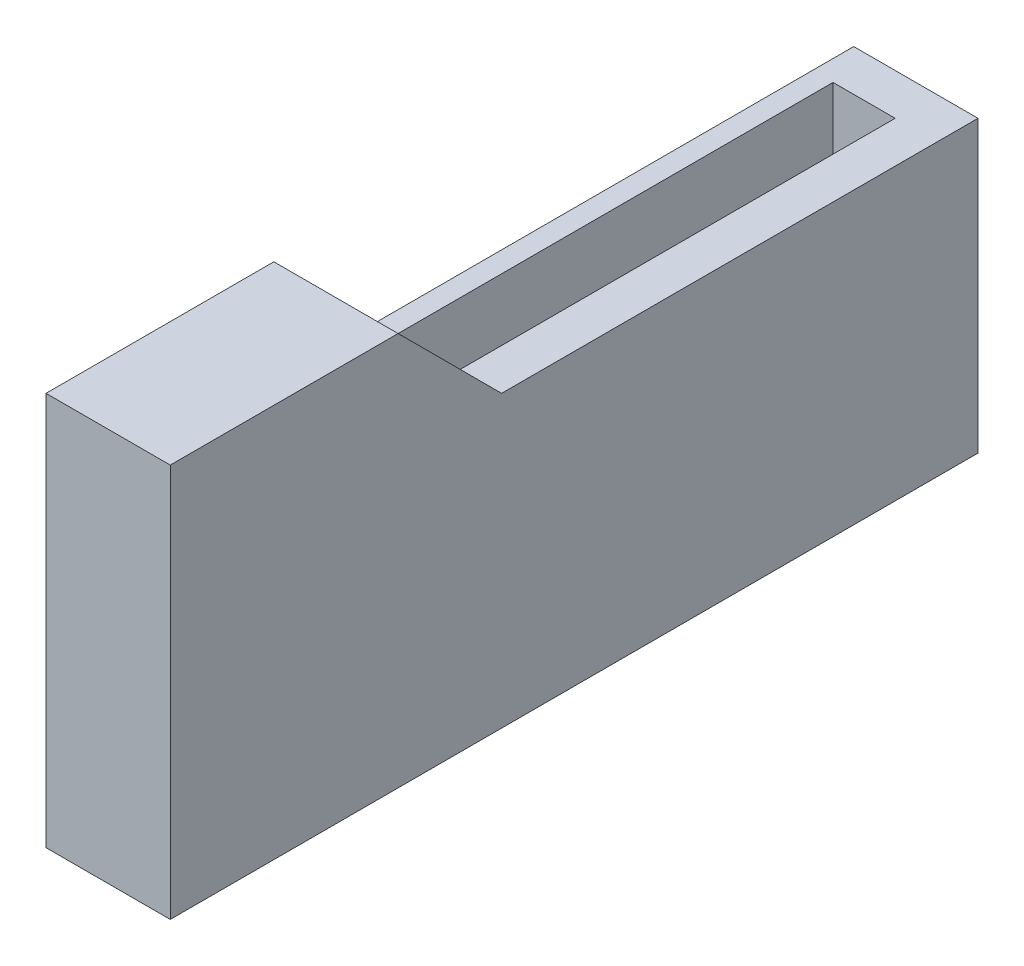
ISO-10303-21;
HEADER;
FILE_DESCRIPTION(('STEP AP214'),'2;1');
FILE_NAME('part.step','',(''),(''),'','','');
FILE_SCHEMA(('AUTOMOTIVE_DESIGN { 1 0 10303 214 1 1 1 1 }'));
ENDSEC;
DATA;
#1=APPLICATION_CONTEXT('core data for automotive mechanical design processes');
#2=APPLICATION_PROTOCOL_DEFINITION('international standard','automotive_design',2000,#1);
#3=PRODUCT_CONTEXT('',#1,'mechanical');
#4=PRODUCT('Part','Part','',(#3));
#5=PRODUCT_RELATED_PRODUCT_CATEGORY('part','',(#4));
#6=PRODUCT_DEFINITION_FORMATION('','',#4);
#7=PRODUCT_DEFINITION_CONTEXT('part definition',#1,'design');
#8=PRODUCT_DEFINITION('design','',#6,#7);
#9=PRODUCT_DEFINITION_SHAPE('','',#8);
#10=(LENGTH_UNIT() NAMED_UNIT(*) SI_UNIT(.MILLI.,.METRE.));
#11=(NAMED_UNIT(*) PLANE_ANGLE_UNIT() SI_UNIT($,.RADIAN.));
#12=(NAMED_UNIT(*) SI_UNIT($,.STERADIAN.) SOLID_ANGLE_UNIT());
#13=UNCERTAINTY_MEASURE_WITH_UNIT(LENGTH_MEASURE(1.E-05),#10,'distance_accuracy_value','');
#14=(GEOMETRIC_REPRESENTATION_CONTEXT(3) GLOBAL_UNCERTAINTY_ASSIGNED_CONTEXT((#13)) GLOBAL_UNIT_ASSIGNED_CONTEXT((#10,
#11,#12)) REPRESENTATION_CONTEXT('',''));
#15=CARTESIAN_POINT('',(0.,0.,0.));
#16=DIRECTION('',(0.,0.,1.));
#17=DIRECTION('',(1.,0.,0.));
#18=AXIS2_PLACEMENT_3D('',#15,#16,#17);
#19=CARTESIAN_POINT('',(0.,14.,10.5));
#20=DIRECTION('',(0.,0.,1.));
#21=DIRECTION('',(1.,0.,0.));
#22=AXIS2_PLACEMENT_3D('',#19,#20,#21);
#23=PLANE('',#22);
#24=DIRECTION('',(0.,-1.,0.));
#25=VECTOR('',#24,1.);
#26=CARTESIAN_POINT('',(-1.5,14.,10.5));
#27=LINE('',#26,#25);
#28=CARTESIAN_POINT('',(-1.5,14.,10.5));
#29=VERTEX_POINT('',#28);
#30=CARTESIAN_POINT('',(-1.5,0.,10.5));
#31=VERTEX_POINT('',#30);
#32=EDGE_CURVE('E151',#29,#31,#27,.T.);
#33=ORIENTED_EDGE('',*,*,#32,.F.);
#34=DIRECTION('',(1.,0.,0.));
#35=VECTOR('',#34,1.);
#36=CARTESIAN_POINT('',(0.,14.,10.5));
#37=LINE('',#36,#35);
#38=CARTESIAN_POINT('',(1.5,14.,10.5));
#39=VERTEX_POINT('',#38);
#40=EDGE_CURVE('E46',#29,#39,#37,.T.);
#41=ORIENTED_EDGE('',*,*,#40,.T.);
#42=DIRECTION('',(0.,-1.,0.));
#43=VECTOR('',#42,1.);
#44=CARTESIAN_POINT('',(1.5,14.,10.5));
#45=LINE('',#44,#43);
#46=CARTESIAN_POINT('',(1.5,0.,10.5));
#47=VERTEX_POINT('',#46);
#48=EDGE_CURVE('E165',#39,#47,#45,.T.);
#49=ORIENTED_EDGE('',*,*,#48,.T.);
#50=DIRECTION('',(-1.,0.,0.));
#51=VECTOR('',#50,1.);
#52=CARTESIAN_POINT('',(0.,0.,10.5));
#53=LINE('',#52,#51);
#54=EDGE_CURVE('E331',#47,#31,#53,.T.);
#55=ORIENTED_EDGE('',*,*,#54,.T.);
#56=EDGE_LOOP('',(#33,#41,#49,#55));
#57=FACE_BOUND('',#56,.T.);
#58=ADVANCED_FACE('F37',(#57),#23,.F.);
#59=CARTESIAN_POINT('',(-1.5,14.,0.));
#60=DIRECTION('',(-1.,0.,0.));
#61=DIRECTION('',(0.,0.,1.));
#62=AXIS2_PLACEMENT_3D('',#59,#60,#61);
#63=PLANE('',#62);
#64=DIRECTION('',(0.,0.,-1.));
#65=VECTOR('',#64,1.);
#66=CARTESIAN_POINT('',(-1.5,0.,0.));
#67=LINE('',#66,#65);
#68=CARTESIAN_POINT('',(-1.5,0.,-10.5));
#69=VERTEX_POINT('',#68);
#70=EDGE_CURVE('E334',#31,#69,#67,.T.);
#71=ORIENTED_EDGE('',*,*,#70,.T.);
#72=DIRECTION('',(0.,-1.,0.));
#73=VECTOR('',#72,1.);
#74=CARTESIAN_POINT('',(-1.5,14.,-10.5));
#75=LINE('',#74,#73);
#76=CARTESIAN_POINT('',(-1.5,14.,-10.5));
#77=VERTEX_POINT('',#76);
#78=EDGE_CURVE('E162',#77,#69,#75,.T.);
#79=ORIENTED_EDGE('',*,*,#78,.F.);
#80=DIRECTION('',(0.,0.,-1.));
#81=VECTOR('',#80,1.);
#82=CARTESIAN_POINT('',(-1.5,14.,0.));
#83=LINE('',#82,#81);
#84=EDGE_CURVE('E155',#29,#77,#83,.T.);
#85=ORIENTED_EDGE('',*,*,#84,.F.);
#86=ORIENTED_EDGE('',*,*,#32,.T.);
#87=EDGE_LOOP('',(#71,#79,#85,#86));
#88=FACE_BOUND('',#87,.T.);
#89=ADVANCED_FACE('F205',(#88),#63,.F.);
#90=CARTESIAN_POINT('',(0.,14.,-10.5));
#91=DIRECTION('',(0.,0.,1.));
#92=DIRECTION('',(1.,0.,0.));
#93=AXIS2_PLACEMENT_3D('',#90,#91,#92);
#94=PLANE('',#93);
#95=DIRECTION('',(-1.,0.,0.));
#96=VECTOR('',#95,1.);
#97=CARTESIAN_POINT('',(0.,0.,-10.5));
#98=LINE('',#97,#96);
#99=CARTESIAN_POINT('',(1.5,0.,-10.5));
#100=VERTEX_POINT('',#99);
#101=EDGE_CURVE('E336',#100,#69,#98,.T.);
#102=ORIENTED_EDGE('',*,*,#101,.F.);
#103=DIRECTION('',(0.,-1.,0.));
#104=VECTOR('',#103,1.);
#105=CARTESIAN_POINT('',(1.5,14.,-10.5));
#106=LINE('',#105,#104);
#107=CARTESIAN_POINT('',(1.5,14.,-10.5));
#108=VERTEX_POINT('',#107);
#109=EDGE_CURVE('E167',#108,#100,#106,.T.);
#110=ORIENTED_EDGE('',*,*,#109,.F.);
#111=DIRECTION('',(-1.,0.,0.));
#112=VECTOR('',#111,1.);
#113=CARTESIAN_POINT('',(0.,14.,-10.5));
#114=LINE('',#113,#112);
#115=EDGE_CURVE('E157',#108,#77,#114,.T.);
#116=ORIENTED_EDGE('',*,*,#115,.T.);
#117=ORIENTED_EDGE('',*,*,#78,.T.);
#118=EDGE_LOOP('',(#102,#110,#116,#117));
#119=FACE_BOUND('',#118,.T.);
#120=ADVANCED_FACE('F210',(#119),#94,.T.);
#121=CARTESIAN_POINT('',(0.,14.,26.5));
#122=DIRECTION('',(0.,0.,-1.));
#123=DIRECTION('',(-1.,0.,0.));
#124=AXIS2_PLACEMENT_3D('',#121,#122,#123);
#125=PLANE('',#124);
#126=DIRECTION('',(1.,0.,0.));
#127=VECTOR('',#126,1.);
#128=CARTESIAN_POINT('',(0.,0.,26.5));
#129=LINE('',#128,#127);
#130=CARTESIAN_POINT('',(-2.5,0.,26.5));
#131=VERTEX_POINT('',#130);
#132=CARTESIAN_POINT('',(3.5,0.,26.5));
#133=VERTEX_POINT('',#132);
#134=EDGE_CURVE('E140',#131,#133,#129,.T.);
#135=ORIENTED_EDGE('',*,*,#134,.T.);
#136=DIRECTION('',(0.,-1.,0.));
#137=VECTOR('',#136,1.);
#138=CARTESIAN_POINT('',(3.5,14.,26.5));
#139=LINE('',#138,#137);
#140=CARTESIAN_POINT('',(3.5,19.,26.5));
#141=VERTEX_POINT('',#140);
#142=EDGE_CURVE('E137',#141,#133,#139,.T.);
#143=ORIENTED_EDGE('',*,*,#142,.F.);
#144=DIRECTION('',(1.,0.,0.));
#145=VECTOR('',#144,1.);
#146=CARTESIAN_POINT('',(-2.5,19.,26.5));
#147=LINE('',#146,#145);
#148=CARTESIAN_POINT('',(-2.5,19.,26.5));
#149=VERTEX_POINT('',#148);
#150=EDGE_CURVE('E120',#149,#141,#147,.T.);
#151=ORIENTED_EDGE('',*,*,#150,.F.);
#152=DIRECTION('',(0.,-1.,0.));
#153=VECTOR('',#152,1.);
#154=CARTESIAN_POINT('',(-2.5,14.,26.5));
#155=LINE('',#154,#153);
#156=EDGE_CURVE('E126',#149,#131,#155,.T.);
#157=ORIENTED_EDGE('',*,*,#156,.T.);
#158=EDGE_LOOP('',(#135,#143,#151,#157));
#159=FACE_BOUND('',#158,.T.);
#160=ADVANCED_FACE('F136',(#159),#125,.F.);
#161=CARTESIAN_POINT('',(3.5,14.,0.));
#162=DIRECTION('',(1.,0.,0.));
#163=DIRECTION('',(0.,0.,-1.));
#164=AXIS2_PLACEMENT_3D('',#161,#162,#163);
#165=PLANE('',#164);
#166=DIRECTION('',(0.,0.,1.));
#167=VECTOR('',#166,1.);
#168=CARTESIAN_POINT('',(3.5,14.,0.));
#169=LINE('',#168,#167);
#170=CARTESIAN_POINT('',(3.5,14.,-12.5));
#171=VERTEX_POINT('',#170);
#172=CARTESIAN_POINT('',(3.5,14.,10.5));
#173=VERTEX_POINT('',#172);
#174=EDGE_CURVE('E344',#171,#173,#169,.T.);
#175=ORIENTED_EDGE('',*,*,#174,.T.);
#176=DIRECTION('',(0.,-0.707106781186549,-0.707106781186546));
#177=VECTOR('',#176,1.);
#178=CARTESIAN_POINT('',(3.5,8.74999999999999,5.25000000000003));
#179=LINE('',#178,#177);
#180=CARTESIAN_POINT('',(3.5,19.,15.5));
#181=VERTEX_POINT('',#180);
#182=EDGE_CURVE('E11',#173,#181,#179,.F.);
#183=ORIENTED_EDGE('',*,*,#182,.T.);
#184=DIRECTION('',(0.,0.,-1.));
#185=VECTOR('',#184,1.);
#186=CARTESIAN_POINT('',(3.5,19.,26.5));
#187=LINE('',#186,#185);
#188=EDGE_CURVE('E138',#141,#181,#187,.T.);
#189=ORIENTED_EDGE('',*,*,#188,.F.);
#190=ORIENTED_EDGE('',*,*,#142,.T.);
#191=DIRECTION('',(0.,0.,1.));
#192=VECTOR('',#191,1.);
#193=CARTESIAN_POINT('',(3.5,0.,0.));
#194=LINE('',#193,#192);
#195=CARTESIAN_POINT('',(3.5,0.,-12.5));
#196=VERTEX_POINT('',#195);
#197=EDGE_CURVE('E358',#196,#133,#194,.T.);
#198=ORIENTED_EDGE('',*,*,#197,.F.);
#199=DIRECTION('',(0.,-1.,0.));
#200=VECTOR('',#199,1.);
#201=CARTESIAN_POINT('',(3.5,14.,-12.5));
#202=LINE('',#201,#200);
#203=EDGE_CURVE('E348',#171,#196,#202,.T.);
#204=ORIENTED_EDGE('',*,*,#203,.F.);
#205=EDGE_LOOP('',(#175,#183,#189,#190,#198,#204));
#206=FACE_BOUND('',#205,.T.);
#207=ADVANCED_FACE('F220',(#206),#165,.T.);
#208=CARTESIAN_POINT('',(0.,14.,-12.5));
#209=DIRECTION('',(0.,0.,-1.));
#210=DIRECTION('',(-1.,0.,0.));
#211=AXIS2_PLACEMENT_3D('',#208,#209,#210);
#212=PLANE('',#211);
#213=DIRECTION('',(1.,0.,0.));
#214=VECTOR('',#213,1.);
#215=CARTESIAN_POINT('',(0.,0.,-12.5));
#216=LINE('',#215,#214);
#217=CARTESIAN_POINT('',(-2.5,0.,-12.5));
#218=VERTEX_POINT('',#217);
#219=EDGE_CURVE('E338',#218,#196,#216,.T.);
#220=ORIENTED_EDGE('',*,*,#219,.F.);
#221=DIRECTION('',(0.,-1.,0.));
#222=VECTOR('',#221,1.);
#223=CARTESIAN_POINT('',(-2.5,14.,-12.5));
#224=LINE('',#223,#222);
#225=CARTESIAN_POINT('',(-2.5,14.,-12.5));
#226=VERTEX_POINT('',#225);
#227=EDGE_CURVE('E133',#226,#218,#224,.T.);
#228=ORIENTED_EDGE('',*,*,#227,.F.);
#229=DIRECTION('',(1.,0.,0.));
#230=VECTOR('',#229,1.);
#231=CARTESIAN_POINT('',(0.,14.,-12.5));
#232=LINE('',#231,#230);
#233=EDGE_CURVE('E350',#226,#171,#232,.T.);
#234=ORIENTED_EDGE('',*,*,#233,.T.);
#235=ORIENTED_EDGE('',*,*,#203,.T.);
#236=EDGE_LOOP('',(#220,#228,#234,#235));
#237=FACE_BOUND('',#236,.T.);
#238=ADVANCED_FACE('F217',(#237),#212,.T.);
#239=CARTESIAN_POINT('',(-2.5,14.,0.));
#240=DIRECTION('',(-1.,0.,0.));
#241=DIRECTION('',(0.,0.,1.));
#242=AXIS2_PLACEMENT_3D('',#239,#240,#241);
#243=PLANE('',#242);
#244=DIRECTION('',(0.,0.,1.));
#245=VECTOR('',#244,1.);
#246=CARTESIAN_POINT('',(-2.5,19.,26.5));
#247=LINE('',#246,#245);
#248=CARTESIAN_POINT('',(-2.5,19.,15.5));
#249=VERTEX_POINT('',#248);
#250=EDGE_CURVE('E116',#249,#149,#247,.T.);
#251=ORIENTED_EDGE('',*,*,#250,.F.);
#252=DIRECTION('',(0.,0.707106781186549,0.707106781186546));
#253=VECTOR('',#252,1.);
#254=CARTESIAN_POINT('',(-2.5,8.74999999999999,5.25000000000004));
#255=LINE('',#254,#253);
#256=CARTESIAN_POINT('',(-2.5,14.,10.5));
#257=VERTEX_POINT('',#256);
#258=EDGE_CURVE('E59',#249,#257,#255,.F.);
#259=ORIENTED_EDGE('',*,*,#258,.T.);
#260=DIRECTION('',(0.,0.,-1.));
#261=VECTOR('',#260,1.);
#262=CARTESIAN_POINT('',(-2.5,14.,0.));
#263=LINE('',#262,#261);
#264=EDGE_CURVE('E152',#257,#226,#263,.T.);
#265=ORIENTED_EDGE('',*,*,#264,.T.);
#266=ORIENTED_EDGE('',*,*,#227,.T.);
#267=DIRECTION('',(0.,0.,-1.));
#268=VECTOR('',#267,1.);
#269=CARTESIAN_POINT('',(-2.5,0.,0.));
#270=LINE('',#269,#268);
#271=EDGE_CURVE('E129',#131,#218,#270,.T.);
#272=ORIENTED_EDGE('',*,*,#271,.F.);
#273=ORIENTED_EDGE('',*,*,#156,.F.);
#274=EDGE_LOOP('',(#251,#259,#265,#266,#272,#273));
#275=FACE_BOUND('',#274,.T.);
#276=ADVANCED_FACE('F127',(#275),#243,.T.);
#277=CARTESIAN_POINT('',(1.5,14.,0.));
#278=DIRECTION('',(-1.,0.,0.));
#279=DIRECTION('',(0.,0.,1.));
#280=AXIS2_PLACEMENT_3D('',#277,#278,#279);
#281=PLANE('',#280);
#282=DIRECTION('',(0.,0.,-1.));
#283=VECTOR('',#282,1.);
#284=CARTESIAN_POINT('',(1.5,0.,0.));
#285=LINE('',#284,#283);
#286=EDGE_CURVE('E192',#47,#100,#285,.T.);
#287=ORIENTED_EDGE('',*,*,#286,.F.);
#288=ORIENTED_EDGE('',*,*,#48,.F.);
#289=DIRECTION('',(0.,0.,-1.));
#290=VECTOR('',#289,1.);
#291=CARTESIAN_POINT('',(1.5,14.,0.));
#292=LINE('',#291,#290);
#293=EDGE_CURVE('E134',#39,#108,#292,.T.);
#294=ORIENTED_EDGE('',*,*,#293,.T.);
#295=ORIENTED_EDGE('',*,*,#109,.T.);
#296=EDGE_LOOP('',(#287,#288,#294,#295));
#297=FACE_BOUND('',#296,.T.);
#298=ADVANCED_FACE('F190',(#297),#281,.T.);
#299=CARTESIAN_POINT('',(0.,14.,0.));
#300=DIRECTION('',(0.,1.,0.));
#301=DIRECTION('',(0.,0.,1.));
#302=AXIS2_PLACEMENT_3D('',#299,#300,#301);
#303=PLANE('',#302);
#304=DIRECTION('',(-1.,0.,0.));
#305=VECTOR('',#304,1.);
#306=CARTESIAN_POINT('',(-2.5,14.,10.5));
#307=LINE('',#306,#305);
#308=EDGE_CURVE('E123',#173,#39,#307,.T.);
#309=ORIENTED_EDGE('',*,*,#308,.F.);
#310=ORIENTED_EDGE('',*,*,#174,.F.);
#311=ORIENTED_EDGE('',*,*,#233,.F.);
#312=ORIENTED_EDGE('',*,*,#264,.F.);
#313=EDGE_CURVE('E148',#29,#257,#307,.T.);
#314=ORIENTED_EDGE('',*,*,#313,.F.);
#315=ORIENTED_EDGE('',*,*,#84,.T.);
#316=ORIENTED_EDGE('',*,*,#115,.F.);
#317=ORIENTED_EDGE('',*,*,#293,.F.);
#318=EDGE_LOOP('',(#309,#310,#311,#312,#314,#315,#316,#317));
#319=FACE_BOUND('',#318,.T.);
#320=ADVANCED_FACE('F195',(#319),#303,.T.);
#321=CARTESIAN_POINT('',(0.,0.,0.));
#322=DIRECTION('',(0.,1.,0.));
#323=DIRECTION('',(0.,0.,1.));
#324=AXIS2_PLACEMENT_3D('',#321,#322,#323);
#325=PLANE('',#324);
#326=ORIENTED_EDGE('',*,*,#134,.F.);
#327=ORIENTED_EDGE('',*,*,#271,.T.);
#328=ORIENTED_EDGE('',*,*,#219,.T.);
#329=ORIENTED_EDGE('',*,*,#197,.T.);
#330=EDGE_LOOP('',(#326,#327,#328,#329));
#331=FACE_BOUND('',#330,.T.);
#332=ORIENTED_EDGE('',*,*,#54,.F.);
#333=ORIENTED_EDGE('',*,*,#286,.T.);
#334=ORIENTED_EDGE('',*,*,#101,.T.);
#335=ORIENTED_EDGE('',*,*,#70,.F.);
#336=EDGE_LOOP('',(#332,#333,#334,#335));
#337=FACE_BOUND('',#336,.T.);
#338=ADVANCED_FACE('F202',(#331,#337),#325,.F.);
#339=CARTESIAN_POINT('',(0.,19.,0.));
#340=DIRECTION('',(0.,-1.,0.));
#341=DIRECTION('',(0.,0.,-1.));
#342=AXIS2_PLACEMENT_3D('',#339,#340,#341);
#343=PLANE('',#342);
#344=ORIENTED_EDGE('',*,*,#188,.T.);
#345=DIRECTION('',(-1.,0.,0.));
#346=VECTOR('',#345,1.);
#347=CARTESIAN_POINT('',(0.,19.,15.5));
#348=LINE('',#347,#346);
#349=EDGE_CURVE('E121',#181,#249,#348,.T.);
#350=ORIENTED_EDGE('',*,*,#349,.T.);
#351=ORIENTED_EDGE('',*,*,#250,.T.);
#352=ORIENTED_EDGE('',*,*,#150,.T.);
#353=EDGE_LOOP('',(#344,#350,#351,#352));
#354=FACE_BOUND('',#353,.T.);
#355=ADVANCED_FACE('F118',(#354),#343,.F.);
#356=CARTESIAN_POINT('',(0.,19.,15.5));
#357=DIRECTION('',(0.,-0.707106781186546,0.707106781186549));
#358=DIRECTION('',(-1.,0.,0.));
#359=AXIS2_PLACEMENT_3D('',#356,#357,#358);
#360=PLANE('',#359);
#361=ORIENTED_EDGE('',*,*,#40,.F.);
#362=ORIENTED_EDGE('',*,*,#313,.T.);
#363=ORIENTED_EDGE('',*,*,#258,.F.);
#364=ORIENTED_EDGE('',*,*,#349,.F.);
#365=ORIENTED_EDGE('',*,*,#182,.F.);
#366=ORIENTED_EDGE('',*,*,#308,.T.);
#367=EDGE_LOOP('',(#361,#362,#363,#364,#365,#366));
#368=FACE_BOUND('',#367,.T.);
#369=ADVANCED_FACE('F39',(#368),#360,.F.);
#370=CLOSED_SHELL('',(#58,#89,#120,#160,#207,#238,#276,#298,#320,#338,#355,#369));
#371=MANIFOLD_SOLID_BREP('B2',#370);
#372=ADVANCED_BREP_SHAPE_REPRESENTATION('',(#18,#371),#14);
#373=SHAPE_DEFINITION_REPRESENTATION(#9,#372);
ENDSEC;
END-ISO-10303-21;
